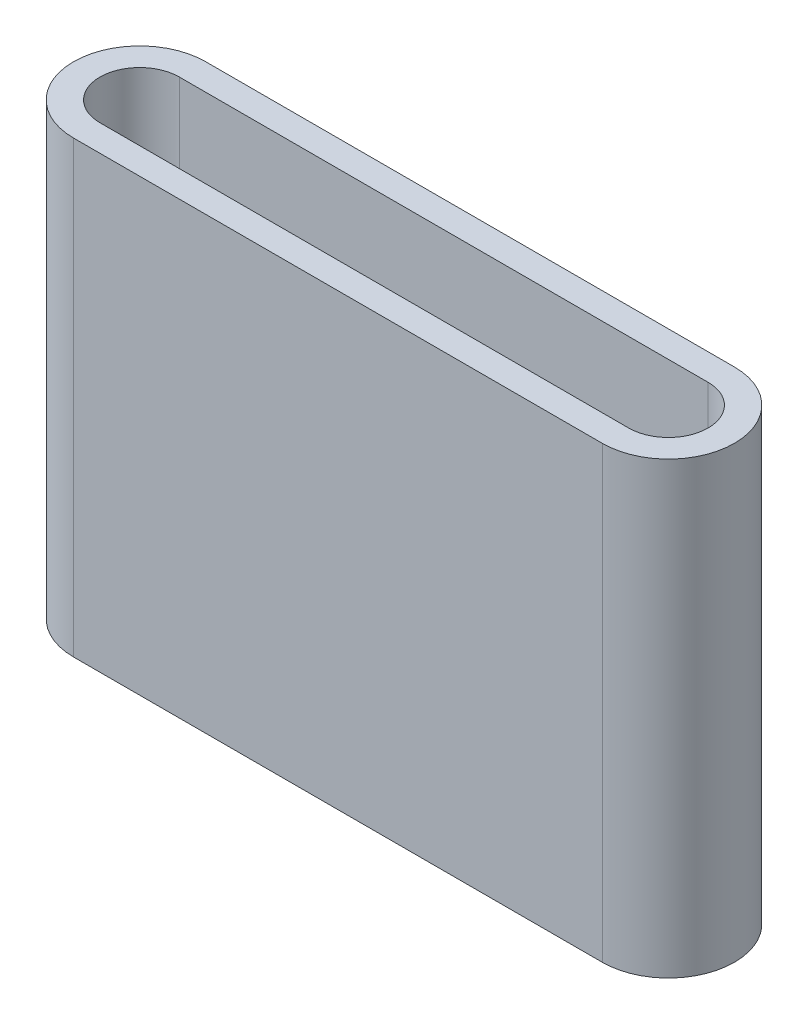
ISO-10303-21;
HEADER;
FILE_DESCRIPTION(('STEP AP214'),'2;1');
FILE_NAME('part.step','',(''),(''),'','','');
FILE_SCHEMA(('AUTOMOTIVE_DESIGN { 1 0 10303 214 1 1 1 1 }'));
ENDSEC;
DATA;
#1=APPLICATION_CONTEXT('core data for automotive mechanical design processes');
#2=APPLICATION_PROTOCOL_DEFINITION('international standard','automotive_design',2000,#1);
#3=PRODUCT_CONTEXT('',#1,'mechanical');
#4=PRODUCT('Part','Part','',(#3));
#5=PRODUCT_RELATED_PRODUCT_CATEGORY('part','',(#4));
#6=PRODUCT_DEFINITION_FORMATION('','',#4);
#7=PRODUCT_DEFINITION_CONTEXT('part definition',#1,'design');
#8=PRODUCT_DEFINITION('design','',#6,#7);
#9=PRODUCT_DEFINITION_SHAPE('','',#8);
#10=(LENGTH_UNIT() NAMED_UNIT(*) SI_UNIT(.MILLI.,.METRE.));
#11=(NAMED_UNIT(*) PLANE_ANGLE_UNIT() SI_UNIT($,.RADIAN.));
#12=(NAMED_UNIT(*) SI_UNIT($,.STERADIAN.) SOLID_ANGLE_UNIT());
#13=UNCERTAINTY_MEASURE_WITH_UNIT(LENGTH_MEASURE(1.E-05),#10,'distance_accuracy_value','');
#14=(GEOMETRIC_REPRESENTATION_CONTEXT(3) GLOBAL_UNCERTAINTY_ASSIGNED_CONTEXT((#13)) GLOBAL_UNIT_ASSIGNED_CONTEXT((#10,
#11,#12)) REPRESENTATION_CONTEXT('',''));
#15=CARTESIAN_POINT('',(0.,0.,0.));
#16=DIRECTION('',(0.,0.,1.));
#17=DIRECTION('',(1.,0.,0.));
#18=AXIS2_PLACEMENT_3D('',#15,#16,#17);
#19=CARTESIAN_POINT('',(0.,-10.,0.));
#20=DIRECTION('',(0.,1.,0.));
#21=DIRECTION('',(0.,0.,1.));
#22=AXIS2_PLACEMENT_3D('',#19,#20,#21);
#23=CYLINDRICAL_SURFACE('',#22,12.5);
#24=DIRECTION('',(0.,1.,0.));
#25=VECTOR('',#24,1.);
#26=CARTESIAN_POINT('',(0.,-10.,12.5));
#27=LINE('',#26,#25);
#28=CARTESIAN_POINT('',(0.,-10.,12.5));
#29=VERTEX_POINT('',#28);
#30=CARTESIAN_POINT('',(0.,75.,12.5));
#31=VERTEX_POINT('',#30);
#32=EDGE_CURVE('E70',#29,#31,#27,.T.);
#33=ORIENTED_EDGE('',*,*,#32,.T.);
#34=CARTESIAN_POINT('',(0.,75.,0.));
#35=DIRECTION('',(0.,1.,0.));
#36=DIRECTION('',(0.,0.,1.));
#37=AXIS2_PLACEMENT_3D('',#34,#35,#36);
#38=CIRCLE('',#37,12.5);
#39=CARTESIAN_POINT('',(0.,75.,-12.5));
#40=VERTEX_POINT('',#39);
#41=EDGE_CURVE('E149',#40,#31,#38,.T.);
#42=ORIENTED_EDGE('',*,*,#41,.F.);
#43=DIRECTION('',(0.,1.,0.));
#44=VECTOR('',#43,1.);
#45=CARTESIAN_POINT('',(0.,-10.,-12.5));
#46=LINE('',#45,#44);
#47=CARTESIAN_POINT('',(0.,-10.,-12.5));
#48=VERTEX_POINT('',#47);
#49=EDGE_CURVE('E12',#48,#40,#46,.T.);
#50=ORIENTED_EDGE('',*,*,#49,.F.);
#51=CARTESIAN_POINT('',(0.,-10.,0.));
#52=DIRECTION('',(0.,1.,0.));
#53=DIRECTION('',(0.,0.,1.));
#54=AXIS2_PLACEMENT_3D('',#51,#52,#53);
#55=CIRCLE('',#54,12.5);
#56=EDGE_CURVE('E196',#48,#29,#55,.T.);
#57=ORIENTED_EDGE('',*,*,#56,.T.);
#58=EDGE_LOOP('',(#33,#42,#50,#57));
#59=FACE_BOUND('',#58,.T.);
#60=ADVANCED_FACE('F67',(#59),#23,.T.);
#61=CARTESIAN_POINT('',(0.,-10.,-12.5));
#62=DIRECTION('',(0.,0.,-1.));
#63=DIRECTION('',(-1.,0.,0.));
#64=AXIS2_PLACEMENT_3D('',#61,#62,#63);
#65=PLANE('',#64);
#66=ORIENTED_EDGE('',*,*,#49,.T.);
#67=DIRECTION('',(-1.,0.,0.));
#68=VECTOR('',#67,1.);
#69=CARTESIAN_POINT('',(100.,75.,-12.5));
#70=LINE('',#69,#68);
#71=CARTESIAN_POINT('',(100.,75.,-12.5));
#72=VERTEX_POINT('',#71);
#73=EDGE_CURVE('E192',#72,#40,#70,.T.);
#74=ORIENTED_EDGE('',*,*,#73,.F.);
#75=DIRECTION('',(0.,1.,0.));
#76=VECTOR('',#75,1.);
#77=CARTESIAN_POINT('',(100.,-10.,-12.5));
#78=LINE('',#77,#76);
#79=CARTESIAN_POINT('',(100.,-10.,-12.5));
#80=VERTEX_POINT('',#79);
#81=EDGE_CURVE('E76',#80,#72,#78,.T.);
#82=ORIENTED_EDGE('',*,*,#81,.F.);
#83=DIRECTION('',(-1.,0.,0.));
#84=VECTOR('',#83,1.);
#85=CARTESIAN_POINT('',(0.,-10.,-12.5));
#86=LINE('',#85,#84);
#87=EDGE_CURVE('E208',#80,#48,#86,.T.);
#88=ORIENTED_EDGE('',*,*,#87,.T.);
#89=EDGE_LOOP('',(#66,#74,#82,#88));
#90=FACE_BOUND('',#89,.T.);
#91=ADVANCED_FACE('F227',(#90),#65,.T.);
#92=CARTESIAN_POINT('',(100.,-10.,0.));
#93=DIRECTION('',(0.,1.,0.));
#94=DIRECTION('',(0.,0.,1.));
#95=AXIS2_PLACEMENT_3D('',#92,#93,#94);
#96=CYLINDRICAL_SURFACE('',#95,12.5);
#97=ORIENTED_EDGE('',*,*,#81,.T.);
#98=CARTESIAN_POINT('',(100.,75.,0.));
#99=DIRECTION('',(0.,1.,0.));
#100=DIRECTION('',(0.,0.,1.));
#101=AXIS2_PLACEMENT_3D('',#98,#99,#100);
#102=CIRCLE('',#101,12.5);
#103=CARTESIAN_POINT('',(100.,75.,12.5));
#104=VERTEX_POINT('',#103);
#105=EDGE_CURVE('E188',#104,#72,#102,.T.);
#106=ORIENTED_EDGE('',*,*,#105,.F.);
#107=DIRECTION('',(0.,1.,0.));
#108=VECTOR('',#107,1.);
#109=CARTESIAN_POINT('',(100.,-10.,12.5));
#110=LINE('',#109,#108);
#111=CARTESIAN_POINT('',(100.,-10.,12.5));
#112=VERTEX_POINT('',#111);
#113=EDGE_CURVE('E213',#112,#104,#110,.T.);
#114=ORIENTED_EDGE('',*,*,#113,.F.);
#115=CARTESIAN_POINT('',(100.,-10.,0.));
#116=DIRECTION('',(0.,1.,0.));
#117=DIRECTION('',(0.,0.,1.));
#118=AXIS2_PLACEMENT_3D('',#115,#116,#117);
#119=CIRCLE('',#118,12.5);
#120=EDGE_CURVE('E204',#112,#80,#119,.T.);
#121=ORIENTED_EDGE('',*,*,#120,.T.);
#122=EDGE_LOOP('',(#97,#106,#114,#121));
#123=FACE_BOUND('',#122,.T.);
#124=ADVANCED_FACE('F233',(#123),#96,.T.);
#125=CARTESIAN_POINT('',(0.,-10.,12.5));
#126=DIRECTION('',(0.,0.,1.));
#127=DIRECTION('',(1.,0.,0.));
#128=AXIS2_PLACEMENT_3D('',#125,#126,#127);
#129=PLANE('',#128);
#130=ORIENTED_EDGE('',*,*,#113,.T.);
#131=DIRECTION('',(1.,0.,0.));
#132=VECTOR('',#131,1.);
#133=CARTESIAN_POINT('',(0.,75.,12.5));
#134=LINE('',#133,#132);
#135=EDGE_CURVE('E184',#31,#104,#134,.T.);
#136=ORIENTED_EDGE('',*,*,#135,.F.);
#137=ORIENTED_EDGE('',*,*,#32,.F.);
#138=DIRECTION('',(1.,0.,0.));
#139=VECTOR('',#138,1.);
#140=CARTESIAN_POINT('',(0.,-10.,12.5));
#141=LINE('',#140,#139);
#142=EDGE_CURVE('E200',#29,#112,#141,.T.);
#143=ORIENTED_EDGE('',*,*,#142,.T.);
#144=EDGE_LOOP('',(#130,#136,#137,#143));
#145=FACE_BOUND('',#144,.T.);
#146=ADVANCED_FACE('F222',(#145),#129,.T.);
#147=CARTESIAN_POINT('',(0.,-10.,0.));
#148=DIRECTION('',(0.,1.,0.));
#149=DIRECTION('',(0.,0.,1.));
#150=AXIS2_PLACEMENT_3D('',#147,#148,#149);
#151=PLANE('',#150);
#152=ORIENTED_EDGE('',*,*,#56,.F.);
#153=ORIENTED_EDGE('',*,*,#87,.F.);
#154=ORIENTED_EDGE('',*,*,#120,.F.);
#155=ORIENTED_EDGE('',*,*,#142,.F.);
#156=EDGE_LOOP('',(#152,#153,#154,#155));
#157=FACE_BOUND('',#156,.T.);
#158=ADVANCED_FACE('F230',(#157),#151,.F.);
#159=CARTESIAN_POINT('',(0.,75.,0.));
#160=DIRECTION('',(0.,1.,0.));
#161=DIRECTION('',(0.,0.,1.));
#162=AXIS2_PLACEMENT_3D('',#159,#160,#161);
#163=PLANE('',#162);
#164=ORIENTED_EDGE('',*,*,#41,.T.);
#165=ORIENTED_EDGE('',*,*,#135,.T.);
#166=ORIENTED_EDGE('',*,*,#105,.T.);
#167=ORIENTED_EDGE('',*,*,#73,.T.);
#168=EDGE_LOOP('',(#164,#165,#166,#167));
#169=FACE_BOUND('',#168,.T.);
#170=DIRECTION('',(1.,0.,0.));
#171=VECTOR('',#170,1.);
#172=CARTESIAN_POINT('',(0.,75.,7.5));
#173=LINE('',#172,#171);
#174=CARTESIAN_POINT('',(0.,75.,7.5));
#175=VERTEX_POINT('',#174);
#176=CARTESIAN_POINT('',(100.,75.,7.5));
#177=VERTEX_POINT('',#176);
#178=EDGE_CURVE('E142',#175,#177,#173,.T.);
#179=ORIENTED_EDGE('',*,*,#178,.F.);
#180=CARTESIAN_POINT('',(0.,75.,0.));
#181=DIRECTION('',(0.,1.,0.));
#182=DIRECTION('',(1.,0.,0.));
#183=AXIS2_PLACEMENT_3D('',#180,#181,#182);
#184=CIRCLE('',#183,7.5);
#185=CARTESIAN_POINT('',(0.,75.,-7.5));
#186=VERTEX_POINT('',#185);
#187=EDGE_CURVE('E132',#186,#175,#184,.T.);
#188=ORIENTED_EDGE('',*,*,#187,.F.);
#189=DIRECTION('',(-1.,0.,0.));
#190=VECTOR('',#189,1.);
#191=CARTESIAN_POINT('',(100.,75.,-7.5));
#192=LINE('',#191,#190);
#193=CARTESIAN_POINT('',(100.,75.,-7.5));
#194=VERTEX_POINT('',#193);
#195=EDGE_CURVE('E159',#194,#186,#192,.T.);
#196=ORIENTED_EDGE('',*,*,#195,.F.);
#197=CARTESIAN_POINT('',(100.,75.,0.));
#198=DIRECTION('',(0.,1.,0.));
#199=DIRECTION('',(1.,0.,0.));
#200=AXIS2_PLACEMENT_3D('',#197,#198,#199);
#201=CIRCLE('',#200,7.5);
#202=EDGE_CURVE('E155',#177,#194,#201,.T.);
#203=ORIENTED_EDGE('',*,*,#202,.F.);
#204=EDGE_LOOP('',(#179,#188,#196,#203));
#205=FACE_BOUND('',#204,.T.);
#206=ADVANCED_FACE('F153',(#169,#205),#163,.T.);
#207=CARTESIAN_POINT('',(0.,75.,0.));
#208=DIRECTION('',(0.,-1.,0.));
#209=DIRECTION('',(0.,0.,-1.));
#210=AXIS2_PLACEMENT_3D('',#207,#208,#209);
#211=CYLINDRICAL_SURFACE('',#210,7.5);
#212=CARTESIAN_POINT('',(0.,20.,0.));
#213=DIRECTION('',(0.,1.,0.));
#214=DIRECTION('',(1.,0.,0.));
#215=AXIS2_PLACEMENT_3D('',#212,#213,#214);
#216=CIRCLE('',#215,7.5);
#217=CARTESIAN_POINT('',(0.,20.,-7.5));
#218=VERTEX_POINT('',#217);
#219=CARTESIAN_POINT('',(0.,20.,7.5));
#220=VERTEX_POINT('',#219);
#221=EDGE_CURVE('E84',#218,#220,#216,.T.);
#222=ORIENTED_EDGE('',*,*,#221,.F.);
#223=DIRECTION('',(0.,-1.,0.));
#224=VECTOR('',#223,1.);
#225=CARTESIAN_POINT('',(0.,75.,-7.5));
#226=LINE('',#225,#224);
#227=EDGE_CURVE('E137',#186,#218,#226,.T.);
#228=ORIENTED_EDGE('',*,*,#227,.F.);
#229=ORIENTED_EDGE('',*,*,#187,.T.);
#230=DIRECTION('',(0.,-1.,0.));
#231=VECTOR('',#230,1.);
#232=CARTESIAN_POINT('',(0.,75.,7.5));
#233=LINE('',#232,#231);
#234=EDGE_CURVE('E135',#175,#220,#233,.T.);
#235=ORIENTED_EDGE('',*,*,#234,.T.);
#236=EDGE_LOOP('',(#222,#228,#229,#235));
#237=FACE_BOUND('',#236,.T.);
#238=ADVANCED_FACE('F134',(#237),#211,.F.);
#239=CARTESIAN_POINT('',(0.,75.,7.5));
#240=DIRECTION('',(0.,0.,-1.));
#241=DIRECTION('',(-1.,0.,0.));
#242=AXIS2_PLACEMENT_3D('',#239,#240,#241);
#243=PLANE('',#242);
#244=DIRECTION('',(1.,0.,0.));
#245=VECTOR('',#244,1.);
#246=CARTESIAN_POINT('',(0.,20.,7.5));
#247=LINE('',#246,#245);
#248=CARTESIAN_POINT('',(100.,20.,7.5));
#249=VERTEX_POINT('',#248);
#250=EDGE_CURVE('E88',#220,#249,#247,.T.);
#251=ORIENTED_EDGE('',*,*,#250,.F.);
#252=ORIENTED_EDGE('',*,*,#234,.F.);
#253=ORIENTED_EDGE('',*,*,#178,.T.);
#254=DIRECTION('',(0.,-1.,0.));
#255=VECTOR('',#254,1.);
#256=CARTESIAN_POINT('',(100.,75.,7.5));
#257=LINE('',#256,#255);
#258=EDGE_CURVE('E150',#177,#249,#257,.T.);
#259=ORIENTED_EDGE('',*,*,#258,.T.);
#260=EDGE_LOOP('',(#251,#252,#253,#259));
#261=FACE_BOUND('',#260,.T.);
#262=ADVANCED_FACE('F146',(#261),#243,.T.);
#263=CARTESIAN_POINT('',(100.,75.,0.));
#264=DIRECTION('',(0.,-1.,0.));
#265=DIRECTION('',(0.,0.,-1.));
#266=AXIS2_PLACEMENT_3D('',#263,#264,#265);
#267=CYLINDRICAL_SURFACE('',#266,7.5);
#268=CARTESIAN_POINT('',(100.,20.,0.));
#269=DIRECTION('',(0.,1.,0.));
#270=DIRECTION('',(1.,0.,0.));
#271=AXIS2_PLACEMENT_3D('',#268,#269,#270);
#272=CIRCLE('',#271,7.5);
#273=CARTESIAN_POINT('',(100.,20.,-7.5));
#274=VERTEX_POINT('',#273);
#275=EDGE_CURVE('E168',#249,#274,#272,.T.);
#276=ORIENTED_EDGE('',*,*,#275,.F.);
#277=ORIENTED_EDGE('',*,*,#258,.F.);
#278=ORIENTED_EDGE('',*,*,#202,.T.);
#279=DIRECTION('',(0.,-1.,0.));
#280=VECTOR('',#279,1.);
#281=CARTESIAN_POINT('',(100.,75.,-7.5));
#282=LINE('',#281,#280);
#283=EDGE_CURVE('E175',#194,#274,#282,.T.);
#284=ORIENTED_EDGE('',*,*,#283,.T.);
#285=EDGE_LOOP('',(#276,#277,#278,#284));
#286=FACE_BOUND('',#285,.T.);
#287=ADVANCED_FACE('F290',(#286),#267,.F.);
#288=CARTESIAN_POINT('',(100.,75.,-7.5));
#289=DIRECTION('',(0.,0.,1.));
#290=DIRECTION('',(1.,0.,0.));
#291=AXIS2_PLACEMENT_3D('',#288,#289,#290);
#292=PLANE('',#291);
#293=DIRECTION('',(-1.,0.,0.));
#294=VECTOR('',#293,1.);
#295=CARTESIAN_POINT('',(100.,20.,-7.5));
#296=LINE('',#295,#294);
#297=EDGE_CURVE('E143',#274,#218,#296,.T.);
#298=ORIENTED_EDGE('',*,*,#297,.F.);
#299=ORIENTED_EDGE('',*,*,#283,.F.);
#300=ORIENTED_EDGE('',*,*,#195,.T.);
#301=ORIENTED_EDGE('',*,*,#227,.T.);
#302=EDGE_LOOP('',(#298,#299,#300,#301));
#303=FACE_BOUND('',#302,.T.);
#304=ADVANCED_FACE('F300',(#303),#292,.T.);
#305=CARTESIAN_POINT('',(0.,20.,0.));
#306=DIRECTION('',(0.,1.,0.));
#307=DIRECTION('',(0.,0.,1.));
#308=AXIS2_PLACEMENT_3D('',#305,#306,#307);
#309=PLANE('',#308);
#310=ORIENTED_EDGE('',*,*,#221,.T.);
#311=ORIENTED_EDGE('',*,*,#250,.T.);
#312=ORIENTED_EDGE('',*,*,#275,.T.);
#313=ORIENTED_EDGE('',*,*,#297,.T.);
#314=EDGE_LOOP('',(#310,#311,#312,#313));
#315=FACE_BOUND('',#314,.T.);
#316=ADVANCED_FACE('F311',(#315),#309,.T.);
#317=CLOSED_SHELL('',(#60,#91,#124,#146,#158,#206,#238,#262,#287,#304,#316));
#318=MANIFOLD_SOLID_BREP('B2',#317);
#319=ADVANCED_BREP_SHAPE_REPRESENTATION('',(#18,#318),#14);
#320=SHAPE_DEFINITION_REPRESENTATION(#9,#319);
ENDSEC;
END-ISO-10303-21;
